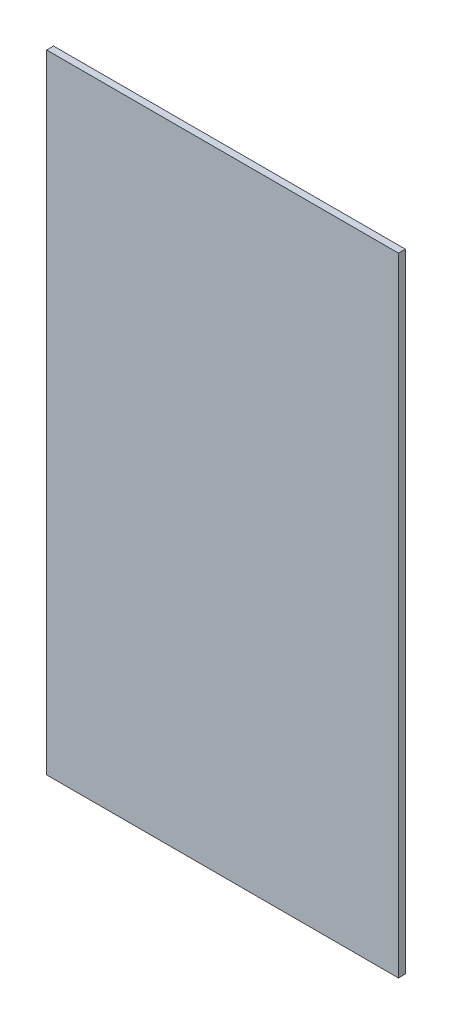
ISO-10303-21;
HEADER;
FILE_DESCRIPTION(('STEP AP214'),'2;1');
FILE_NAME('part.step','',(''),(''),'','','');
FILE_SCHEMA(('AUTOMOTIVE_DESIGN { 1 0 10303 214 1 1 1 1 }'));
ENDSEC;
DATA;
#1=APPLICATION_CONTEXT('core data for automotive mechanical design processes');
#2=APPLICATION_PROTOCOL_DEFINITION('international standard','automotive_design',2000,#1);
#3=PRODUCT_CONTEXT('',#1,'mechanical');
#4=PRODUCT('Part','Part','',(#3));
#5=PRODUCT_RELATED_PRODUCT_CATEGORY('part','',(#4));
#6=PRODUCT_DEFINITION_FORMATION('','',#4);
#7=PRODUCT_DEFINITION_CONTEXT('part definition',#1,'design');
#8=PRODUCT_DEFINITION('design','',#6,#7);
#9=PRODUCT_DEFINITION_SHAPE('','',#8);
#10=(LENGTH_UNIT() NAMED_UNIT(*) SI_UNIT(.MILLI.,.METRE.));
#11=(NAMED_UNIT(*) PLANE_ANGLE_UNIT() SI_UNIT($,.RADIAN.));
#12=(NAMED_UNIT(*) SI_UNIT($,.STERADIAN.) SOLID_ANGLE_UNIT());
#13=UNCERTAINTY_MEASURE_WITH_UNIT(LENGTH_MEASURE(1.E-05),#10,'distance_accuracy_value','');
#14=(GEOMETRIC_REPRESENTATION_CONTEXT(3) GLOBAL_UNCERTAINTY_ASSIGNED_CONTEXT((#13)) GLOBAL_UNIT_ASSIGNED_CONTEXT((#10,
#11,#12)) REPRESENTATION_CONTEXT('',''));
#15=CARTESIAN_POINT('',(0.,0.,0.));
#16=DIRECTION('',(0.,0.,1.));
#17=DIRECTION('',(1.,0.,0.));
#18=AXIS2_PLACEMENT_3D('',#15,#16,#17);
#19=CARTESIAN_POINT('',(277.5,477.5,-5.));
#20=DIRECTION('',(0.,1.,0.));
#21=DIRECTION('',(0.,0.,1.));
#22=AXIS2_PLACEMENT_3D('',#19,#20,#21);
#23=PLANE('',#22);
#24=DIRECTION('',(-1.,0.,0.));
#25=VECTOR('',#24,1.);
#26=CARTESIAN_POINT('',(277.5,477.5,0.));
#27=LINE('',#26,#25);
#28=CARTESIAN_POINT('',(277.5,477.5,0.));
#29=VERTEX_POINT('',#28);
#30=CARTESIAN_POINT('',(22.5,477.5,0.));
#31=VERTEX_POINT('',#30);
#32=EDGE_CURVE('E100',#29,#31,#27,.T.);
#33=ORIENTED_EDGE('',*,*,#32,.F.);
#34=DIRECTION('',(0.,0.,1.));
#35=VECTOR('',#34,1.);
#36=CARTESIAN_POINT('',(277.5,477.5,-5.));
#37=LINE('',#36,#35);
#38=CARTESIAN_POINT('',(277.5,477.5,-5.));
#39=VERTEX_POINT('',#38);
#40=EDGE_CURVE('E11',#39,#29,#37,.T.);
#41=ORIENTED_EDGE('',*,*,#40,.F.);
#42=DIRECTION('',(-1.,0.,0.));
#43=VECTOR('',#42,1.);
#44=CARTESIAN_POINT('',(277.5,477.5,-5.));
#45=LINE('',#44,#43);
#46=CARTESIAN_POINT('',(22.5,477.5,-5.));
#47=VERTEX_POINT('',#46);
#48=EDGE_CURVE('E94',#39,#47,#45,.T.);
#49=ORIENTED_EDGE('',*,*,#48,.T.);
#50=DIRECTION('',(0.,0.,1.));
#51=VECTOR('',#50,1.);
#52=CARTESIAN_POINT('',(22.5,477.5,-5.));
#53=LINE('',#52,#51);
#54=EDGE_CURVE('E39',#47,#31,#53,.T.);
#55=ORIENTED_EDGE('',*,*,#54,.T.);
#56=EDGE_LOOP('',(#33,#41,#49,#55));
#57=FACE_BOUND('',#56,.T.);
#58=ADVANCED_FACE('F36',(#57),#23,.T.);
#59=CARTESIAN_POINT('',(277.5,22.5,-5.));
#60=DIRECTION('',(1.,0.,0.));
#61=DIRECTION('',(0.,0.,-1.));
#62=AXIS2_PLACEMENT_3D('',#59,#60,#61);
#63=PLANE('',#62);
#64=DIRECTION('',(0.,1.,0.));
#65=VECTOR('',#64,1.);
#66=CARTESIAN_POINT('',(277.5,22.5,0.));
#67=LINE('',#66,#65);
#68=CARTESIAN_POINT('',(277.5,22.5,0.));
#69=VERTEX_POINT('',#68);
#70=EDGE_CURVE('E96',#69,#29,#67,.T.);
#71=ORIENTED_EDGE('',*,*,#70,.F.);
#72=DIRECTION('',(0.,0.,1.));
#73=VECTOR('',#72,1.);
#74=CARTESIAN_POINT('',(277.5,22.5,-5.));
#75=LINE('',#74,#73);
#76=CARTESIAN_POINT('',(277.5,22.5,-5.));
#77=VERTEX_POINT('',#76);
#78=EDGE_CURVE('E45',#77,#69,#75,.T.);
#79=ORIENTED_EDGE('',*,*,#78,.F.);
#80=DIRECTION('',(0.,1.,0.));
#81=VECTOR('',#80,1.);
#82=CARTESIAN_POINT('',(277.5,22.5,-5.));
#83=LINE('',#82,#81);
#84=EDGE_CURVE('E91',#77,#39,#83,.T.);
#85=ORIENTED_EDGE('',*,*,#84,.T.);
#86=ORIENTED_EDGE('',*,*,#40,.T.);
#87=EDGE_LOOP('',(#71,#79,#85,#86));
#88=FACE_BOUND('',#87,.T.);
#89=ADVANCED_FACE('F110',(#88),#63,.T.);
#90=CARTESIAN_POINT('',(22.5,22.5,-5.));
#91=DIRECTION('',(0.,-1.,0.));
#92=DIRECTION('',(0.,0.,-1.));
#93=AXIS2_PLACEMENT_3D('',#90,#91,#92);
#94=PLANE('',#93);
#95=DIRECTION('',(1.,0.,0.));
#96=VECTOR('',#95,1.);
#97=CARTESIAN_POINT('',(22.5,22.5,0.));
#98=LINE('',#97,#96);
#99=CARTESIAN_POINT('',(22.5,22.5,0.));
#100=VERTEX_POINT('',#99);
#101=EDGE_CURVE('E86',#100,#69,#98,.T.);
#102=ORIENTED_EDGE('',*,*,#101,.F.);
#103=DIRECTION('',(0.,0.,1.));
#104=VECTOR('',#103,1.);
#105=CARTESIAN_POINT('',(22.5,22.5,-5.));
#106=LINE('',#105,#104);
#107=CARTESIAN_POINT('',(22.5,22.5,-5.));
#108=VERTEX_POINT('',#107);
#109=EDGE_CURVE('E81',#108,#100,#106,.T.);
#110=ORIENTED_EDGE('',*,*,#109,.F.);
#111=DIRECTION('',(1.,0.,0.));
#112=VECTOR('',#111,1.);
#113=CARTESIAN_POINT('',(22.5,22.5,-5.));
#114=LINE('',#113,#112);
#115=EDGE_CURVE('E84',#108,#77,#114,.T.);
#116=ORIENTED_EDGE('',*,*,#115,.T.);
#117=ORIENTED_EDGE('',*,*,#78,.T.);
#118=EDGE_LOOP('',(#102,#110,#116,#117));
#119=FACE_BOUND('',#118,.T.);
#120=ADVANCED_FACE('F83',(#119),#94,.T.);
#121=CARTESIAN_POINT('',(22.5,477.5,-5.));
#122=DIRECTION('',(-1.,0.,0.));
#123=DIRECTION('',(0.,0.,1.));
#124=AXIS2_PLACEMENT_3D('',#121,#122,#123);
#125=PLANE('',#124);
#126=DIRECTION('',(0.,-1.,0.));
#127=VECTOR('',#126,1.);
#128=CARTESIAN_POINT('',(22.5,477.5,0.));
#129=LINE('',#128,#127);
#130=EDGE_CURVE('E103',#31,#100,#129,.T.);
#131=ORIENTED_EDGE('',*,*,#130,.F.);
#132=ORIENTED_EDGE('',*,*,#54,.F.);
#133=DIRECTION('',(0.,-1.,0.));
#134=VECTOR('',#133,1.);
#135=CARTESIAN_POINT('',(22.5,477.5,-5.));
#136=LINE('',#135,#134);
#137=EDGE_CURVE('E90',#47,#108,#136,.T.);
#138=ORIENTED_EDGE('',*,*,#137,.T.);
#139=ORIENTED_EDGE('',*,*,#109,.T.);
#140=EDGE_LOOP('',(#131,#132,#138,#139));
#141=FACE_BOUND('',#140,.T.);
#142=ADVANCED_FACE('F93',(#141),#125,.T.);
#143=CARTESIAN_POINT('',(0.,0.,-5.));
#144=DIRECTION('',(0.,0.,1.));
#145=DIRECTION('',(1.,0.,0.));
#146=AXIS2_PLACEMENT_3D('',#143,#144,#145);
#147=PLANE('',#146);
#148=ORIENTED_EDGE('',*,*,#48,.F.);
#149=ORIENTED_EDGE('',*,*,#84,.F.);
#150=ORIENTED_EDGE('',*,*,#115,.F.);
#151=ORIENTED_EDGE('',*,*,#137,.F.);
#152=EDGE_LOOP('',(#148,#149,#150,#151));
#153=FACE_BOUND('',#152,.T.);
#154=ADVANCED_FACE('F89',(#153),#147,.F.);
#155=CARTESIAN_POINT('',(0.,0.,0.));
#156=DIRECTION('',(0.,0.,1.));
#157=DIRECTION('',(1.,0.,0.));
#158=AXIS2_PLACEMENT_3D('',#155,#156,#157);
#159=PLANE('',#158);
#160=ORIENTED_EDGE('',*,*,#32,.T.);
#161=ORIENTED_EDGE('',*,*,#130,.T.);
#162=ORIENTED_EDGE('',*,*,#101,.T.);
#163=ORIENTED_EDGE('',*,*,#70,.T.);
#164=EDGE_LOOP('',(#160,#161,#162,#163));
#165=FACE_BOUND('',#164,.T.);
#166=ADVANCED_FACE('F109',(#165),#159,.T.);
#167=CLOSED_SHELL('',(#58,#89,#120,#142,#154,#166));
#168=MANIFOLD_SOLID_BREP('B2',#167);
#169=ADVANCED_BREP_SHAPE_REPRESENTATION('',(#18,#168),#14);
#170=SHAPE_DEFINITION_REPRESENTATION(#9,#169);
ENDSEC;
END-ISO-10303-21;
